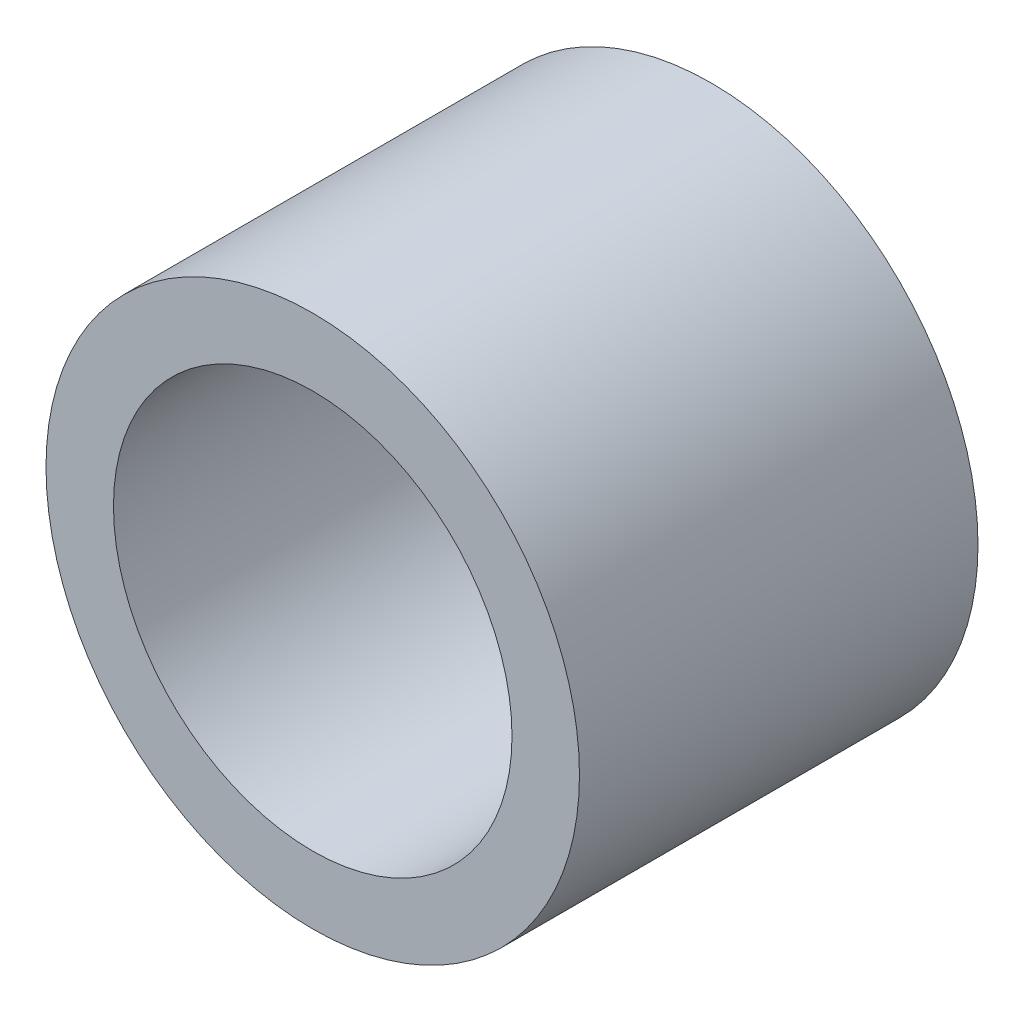
ISO-10303-21;
HEADER;
FILE_DESCRIPTION(('STEP AP214'),'2;1');
FILE_NAME('part.step','',(''),(''),'','','');
FILE_SCHEMA(('AUTOMOTIVE_DESIGN { 1 0 10303 214 1 1 1 1 }'));
ENDSEC;
DATA;
#1=APPLICATION_CONTEXT('core data for automotive mechanical design processes');
#2=APPLICATION_PROTOCOL_DEFINITION('international standard','automotive_design',2000,#1);
#3=PRODUCT_CONTEXT('',#1,'mechanical');
#4=PRODUCT('Part','Part','',(#3));
#5=PRODUCT_RELATED_PRODUCT_CATEGORY('part','',(#4));
#6=PRODUCT_DEFINITION_FORMATION('','',#4);
#7=PRODUCT_DEFINITION_CONTEXT('part definition',#1,'design');
#8=PRODUCT_DEFINITION('design','',#6,#7);
#9=PRODUCT_DEFINITION_SHAPE('','',#8);
#10=(LENGTH_UNIT() NAMED_UNIT(*) SI_UNIT(.MILLI.,.METRE.));
#11=(NAMED_UNIT(*) PLANE_ANGLE_UNIT() SI_UNIT($,.RADIAN.));
#12=(NAMED_UNIT(*) SI_UNIT($,.STERADIAN.) SOLID_ANGLE_UNIT());
#13=UNCERTAINTY_MEASURE_WITH_UNIT(LENGTH_MEASURE(1.E-05),#10,'distance_accuracy_value','');
#14=(GEOMETRIC_REPRESENTATION_CONTEXT(3) GLOBAL_UNCERTAINTY_ASSIGNED_CONTEXT((#13)) GLOBAL_UNIT_ASSIGNED_CONTEXT((#10,
#11,#12)) REPRESENTATION_CONTEXT('',''));
#15=CARTESIAN_POINT('',(0.,0.,0.));
#16=DIRECTION('',(0.,0.,1.));
#17=DIRECTION('',(1.,0.,0.));
#18=AXIS2_PLACEMENT_3D('',#15,#16,#17);
#19=CARTESIAN_POINT('',(0.,0.,12.7));
#20=DIRECTION('',(0.,0.,1.));
#21=DIRECTION('',(1.,0.,0.));
#22=AXIS2_PLACEMENT_3D('',#19,#20,#21);
#23=PLANE('',#22);
#24=CARTESIAN_POINT('',(0.,0.,12.7));
#25=DIRECTION('',(0.,0.,1.));
#26=DIRECTION('',(1.,0.,0.));
#27=AXIS2_PLACEMENT_3D('',#24,#25,#26);
#28=CIRCLE('',#27,8.5);
#29=CARTESIAN_POINT('',(8.5,0.,12.7));
#30=VERTEX_POINT('',#29);
#31=EDGE_CURVE('E10',#30,#30,#28,.T.);
#32=ORIENTED_EDGE('',*,*,#31,.T.);
#33=EDGE_LOOP('',(#32));
#34=FACE_BOUND('',#33,.T.);
#35=CARTESIAN_POINT('',(0.,0.,12.7));
#36=DIRECTION('',(0.,0.,1.));
#37=DIRECTION('',(1.,0.,0.));
#38=AXIS2_PLACEMENT_3D('',#35,#36,#37);
#39=CIRCLE('',#38,6.35);
#40=CARTESIAN_POINT('',(6.35,0.,12.7));
#41=VERTEX_POINT('',#40);
#42=EDGE_CURVE('E42',#41,#41,#39,.T.);
#43=ORIENTED_EDGE('',*,*,#42,.F.);
#44=EDGE_LOOP('',(#43));
#45=FACE_BOUND('',#44,.T.);
#46=ADVANCED_FACE('F31',(#34,#45),#23,.T.);
#47=CARTESIAN_POINT('',(0.,0.,0.));
#48=DIRECTION('',(0.,0.,1.));
#49=DIRECTION('',(1.,0.,0.));
#50=AXIS2_PLACEMENT_3D('',#47,#48,#49);
#51=PLANE('',#50);
#52=CARTESIAN_POINT('',(0.,0.,0.));
#53=DIRECTION('',(0.,0.,1.));
#54=DIRECTION('',(1.,0.,0.));
#55=AXIS2_PLACEMENT_3D('',#52,#53,#54);
#56=CIRCLE('',#55,8.5);
#57=CARTESIAN_POINT('',(8.5,0.,0.));
#58=VERTEX_POINT('',#57);
#59=EDGE_CURVE('E35',#58,#58,#56,.T.);
#60=ORIENTED_EDGE('',*,*,#59,.F.);
#61=EDGE_LOOP('',(#60));
#62=FACE_BOUND('',#61,.T.);
#63=CARTESIAN_POINT('',(0.,0.,0.));
#64=DIRECTION('',(0.,0.,1.));
#65=DIRECTION('',(1.,0.,0.));
#66=AXIS2_PLACEMENT_3D('',#63,#64,#65);
#67=CIRCLE('',#66,6.35);
#68=CARTESIAN_POINT('',(6.35,0.,0.));
#69=VERTEX_POINT('',#68);
#70=EDGE_CURVE('E44',#69,#69,#67,.T.);
#71=ORIENTED_EDGE('',*,*,#70,.T.);
#72=EDGE_LOOP('',(#71));
#73=FACE_BOUND('',#72,.T.);
#74=ADVANCED_FACE('F54',(#62,#73),#51,.F.);
#75=CARTESIAN_POINT('',(0.,0.,12.7));
#76=DIRECTION('',(0.,0.,-1.));
#77=DIRECTION('',(-1.,0.,0.));
#78=AXIS2_PLACEMENT_3D('',#75,#76,#77);
#79=CYLINDRICAL_SURFACE('',#78,8.5);
#80=ORIENTED_EDGE('',*,*,#31,.F.);
#81=EDGE_LOOP('',(#80));
#82=FACE_BOUND('',#81,.T.);
#83=ORIENTED_EDGE('',*,*,#59,.T.);
#84=EDGE_LOOP('',(#83));
#85=FACE_BOUND('',#84,.T.);
#86=ADVANCED_FACE('F33',(#82,#85),#79,.T.);
#87=CARTESIAN_POINT('',(0.,0.,12.7));
#88=DIRECTION('',(0.,0.,-1.));
#89=DIRECTION('',(-1.,0.,0.));
#90=AXIS2_PLACEMENT_3D('',#87,#88,#89);
#91=CYLINDRICAL_SURFACE('',#90,6.35);
#92=ORIENTED_EDGE('',*,*,#42,.T.);
#93=EDGE_LOOP('',(#92));
#94=FACE_BOUND('',#93,.T.);
#95=ORIENTED_EDGE('',*,*,#70,.F.);
#96=EDGE_LOOP('',(#95));
#97=FACE_BOUND('',#96,.T.);
#98=ADVANCED_FACE('F50',(#94,#97),#91,.F.);
#99=CLOSED_SHELL('',(#46,#74,#86,#98));
#100=MANIFOLD_SOLID_BREP('B2',#99);
#101=ADVANCED_BREP_SHAPE_REPRESENTATION('',(#18,#100),#14);
#102=SHAPE_DEFINITION_REPRESENTATION(#9,#101);
ENDSEC;
END-ISO-10303-21;
